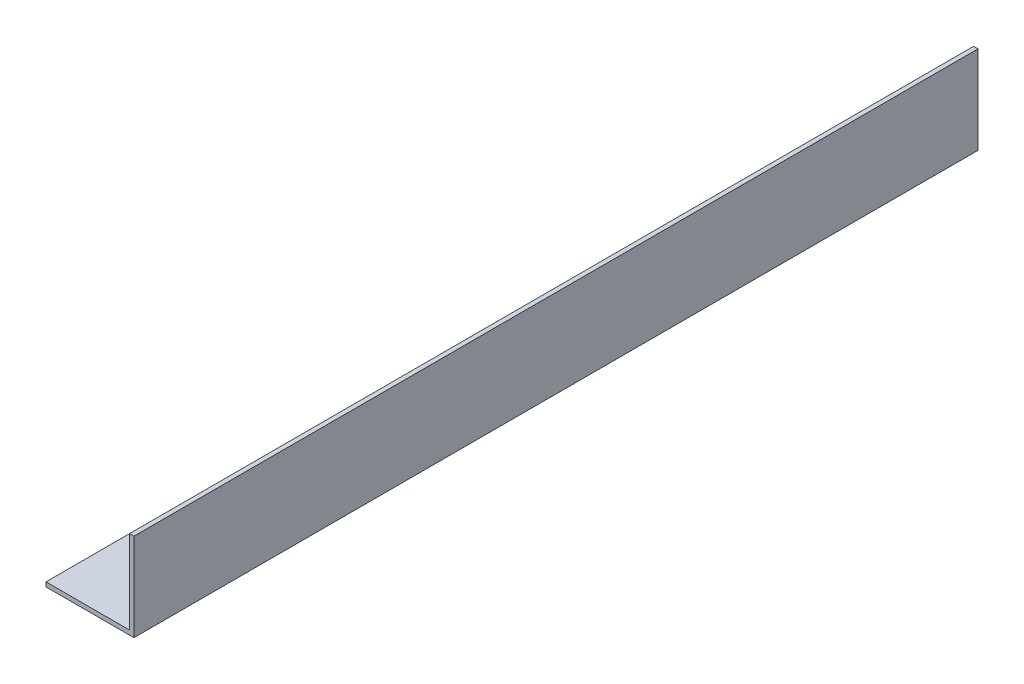
ISO-10303-21;
HEADER;
FILE_DESCRIPTION(('STEP AP214'),'2;1');
FILE_NAME('part.step','',(''),(''),'','','');
FILE_SCHEMA(('AUTOMOTIVE_DESIGN { 1 0 10303 214 1 1 1 1 }'));
ENDSEC;
DATA;
#1=APPLICATION_CONTEXT('core data for automotive mechanical design processes');
#2=APPLICATION_PROTOCOL_DEFINITION('international standard','automotive_design',2000,#1);
#3=PRODUCT_CONTEXT('',#1,'mechanical');
#4=PRODUCT('Part','Part','',(#3));
#5=PRODUCT_RELATED_PRODUCT_CATEGORY('part','',(#4));
#6=PRODUCT_DEFINITION_FORMATION('','',#4);
#7=PRODUCT_DEFINITION_CONTEXT('part definition',#1,'design');
#8=PRODUCT_DEFINITION('design','',#6,#7);
#9=PRODUCT_DEFINITION_SHAPE('','',#8);
#10=(LENGTH_UNIT() NAMED_UNIT(*) SI_UNIT(.MILLI.,.METRE.));
#11=(NAMED_UNIT(*) PLANE_ANGLE_UNIT() SI_UNIT($,.RADIAN.));
#12=(NAMED_UNIT(*) SI_UNIT($,.STERADIAN.) SOLID_ANGLE_UNIT());
#13=UNCERTAINTY_MEASURE_WITH_UNIT(LENGTH_MEASURE(1.E-05),#10,'distance_accuracy_value','');
#14=(GEOMETRIC_REPRESENTATION_CONTEXT(3) GLOBAL_UNCERTAINTY_ASSIGNED_CONTEXT((#13)) GLOBAL_UNIT_ASSIGNED_CONTEXT((#10,
#11,#12)) REPRESENTATION_CONTEXT('',''));
#15=CARTESIAN_POINT('',(0.,0.,0.));
#16=DIRECTION('',(0.,0.,1.));
#17=DIRECTION('',(1.,0.,0.));
#18=AXIS2_PLACEMENT_3D('',#15,#16,#17);
#19=CARTESIAN_POINT('',(-15.875,0.,152.4));
#20=DIRECTION('',(1.,0.,0.));
#21=DIRECTION('',(0.,0.,-1.));
#22=AXIS2_PLACEMENT_3D('',#19,#20,#21);
#23=PLANE('',#22);
#24=DIRECTION('',(0.,-1.,0.));
#25=VECTOR('',#24,1.);
#26=CARTESIAN_POINT('',(-15.875,0.,-152.4));
#27=LINE('',#26,#25);
#28=CARTESIAN_POINT('',(-15.875,1.5875,-152.4));
#29=VERTEX_POINT('',#28);
#30=CARTESIAN_POINT('',(-15.875,0.,-152.4));
#31=VERTEX_POINT('',#30);
#32=EDGE_CURVE('E122',#29,#31,#27,.T.);
#33=ORIENTED_EDGE('',*,*,#32,.T.);
#34=DIRECTION('',(0.,0.,-1.));
#35=VECTOR('',#34,1.);
#36=CARTESIAN_POINT('',(-15.875,0.,152.4));
#37=LINE('',#36,#35);
#38=CARTESIAN_POINT('',(-15.875,0.,152.4));
#39=VERTEX_POINT('',#38);
#40=EDGE_CURVE('E11',#39,#31,#37,.T.);
#41=ORIENTED_EDGE('',*,*,#40,.F.);
#42=DIRECTION('',(0.,-1.,0.));
#43=VECTOR('',#42,1.);
#44=CARTESIAN_POINT('',(-15.875,0.,152.4));
#45=LINE('',#44,#43);
#46=CARTESIAN_POINT('',(-15.875,1.5875,152.4));
#47=VERTEX_POINT('',#46);
#48=EDGE_CURVE('E134',#47,#39,#45,.T.);
#49=ORIENTED_EDGE('',*,*,#48,.F.);
#50=DIRECTION('',(0.,0.,-1.));
#51=VECTOR('',#50,1.);
#52=CARTESIAN_POINT('',(-15.875,1.5875,152.4));
#53=LINE('',#52,#51);
#54=EDGE_CURVE('E118',#47,#29,#53,.T.);
#55=ORIENTED_EDGE('',*,*,#54,.T.);
#56=EDGE_LOOP('',(#33,#41,#49,#55));
#57=FACE_BOUND('',#56,.T.);
#58=ADVANCED_FACE('F32',(#57),#23,.F.);
#59=CARTESIAN_POINT('',(-15.875,0.,152.4));
#60=DIRECTION('',(0.,1.,0.));
#61=DIRECTION('',(0.,0.,1.));
#62=AXIS2_PLACEMENT_3D('',#59,#60,#61);
#63=PLANE('',#62);
#64=DIRECTION('',(1.,0.,0.));
#65=VECTOR('',#64,1.);
#66=CARTESIAN_POINT('',(-15.875,0.,-152.4));
#67=LINE('',#66,#65);
#68=CARTESIAN_POINT('',(15.875,0.,-152.4));
#69=VERTEX_POINT('',#68);
#70=EDGE_CURVE('E125',#31,#69,#67,.T.);
#71=ORIENTED_EDGE('',*,*,#70,.T.);
#72=DIRECTION('',(0.,0.,-1.));
#73=VECTOR('',#72,1.);
#74=CARTESIAN_POINT('',(15.875,0.,152.4));
#75=LINE('',#74,#73);
#76=CARTESIAN_POINT('',(15.875,0.,152.4));
#77=VERTEX_POINT('',#76);
#78=EDGE_CURVE('E40',#77,#69,#75,.T.);
#79=ORIENTED_EDGE('',*,*,#78,.F.);
#80=DIRECTION('',(1.,0.,0.));
#81=VECTOR('',#80,1.);
#82=CARTESIAN_POINT('',(-15.875,0.,152.4));
#83=LINE('',#82,#81);
#84=EDGE_CURVE('E88',#39,#77,#83,.T.);
#85=ORIENTED_EDGE('',*,*,#84,.F.);
#86=ORIENTED_EDGE('',*,*,#40,.T.);
#87=EDGE_LOOP('',(#71,#79,#85,#86));
#88=FACE_BOUND('',#87,.T.);
#89=ADVANCED_FACE('F159',(#88),#63,.F.);
#90=CARTESIAN_POINT('',(15.875,0.,152.4));
#91=DIRECTION('',(-1.,0.,0.));
#92=DIRECTION('',(0.,0.,1.));
#93=AXIS2_PLACEMENT_3D('',#90,#91,#92);
#94=PLANE('',#93);
#95=DIRECTION('',(0.,1.,0.));
#96=VECTOR('',#95,1.);
#97=CARTESIAN_POINT('',(15.875,0.,-152.4));
#98=LINE('',#97,#96);
#99=CARTESIAN_POINT('',(15.875,31.75,-152.4));
#100=VERTEX_POINT('',#99);
#101=EDGE_CURVE('E127',#69,#100,#98,.T.);
#102=ORIENTED_EDGE('',*,*,#101,.T.);
#103=DIRECTION('',(0.,0.,-1.));
#104=VECTOR('',#103,1.);
#105=CARTESIAN_POINT('',(15.875,31.75,152.4));
#106=LINE('',#105,#104);
#107=CARTESIAN_POINT('',(15.875,31.75,152.4));
#108=VERTEX_POINT('',#107);
#109=EDGE_CURVE('E138',#108,#100,#106,.T.);
#110=ORIENTED_EDGE('',*,*,#109,.F.);
#111=DIRECTION('',(0.,1.,0.));
#112=VECTOR('',#111,1.);
#113=CARTESIAN_POINT('',(15.875,0.,152.4));
#114=LINE('',#113,#112);
#115=EDGE_CURVE('E146',#77,#108,#114,.T.);
#116=ORIENTED_EDGE('',*,*,#115,.F.);
#117=ORIENTED_EDGE('',*,*,#78,.T.);
#118=EDGE_LOOP('',(#102,#110,#116,#117));
#119=FACE_BOUND('',#118,.T.);
#120=ADVANCED_FACE('F144',(#119),#94,.F.);
#121=CARTESIAN_POINT('',(15.875,31.75,152.4));
#122=DIRECTION('',(0.,-1.,0.));
#123=DIRECTION('',(0.,0.,-1.));
#124=AXIS2_PLACEMENT_3D('',#121,#122,#123);
#125=PLANE('',#124);
#126=DIRECTION('',(-1.,0.,0.));
#127=VECTOR('',#126,1.);
#128=CARTESIAN_POINT('',(15.875,31.75,-152.4));
#129=LINE('',#128,#127);
#130=CARTESIAN_POINT('',(14.2875,31.75,-152.4));
#131=VERTEX_POINT('',#130);
#132=EDGE_CURVE('E129',#100,#131,#129,.T.);
#133=ORIENTED_EDGE('',*,*,#132,.T.);
#134=DIRECTION('',(0.,0.,-1.));
#135=VECTOR('',#134,1.);
#136=CARTESIAN_POINT('',(14.2875,31.75,152.4));
#137=LINE('',#136,#135);
#138=CARTESIAN_POINT('',(14.2875,31.75,152.4));
#139=VERTEX_POINT('',#138);
#140=EDGE_CURVE('E113',#139,#131,#137,.T.);
#141=ORIENTED_EDGE('',*,*,#140,.F.);
#142=DIRECTION('',(-1.,0.,0.));
#143=VECTOR('',#142,1.);
#144=CARTESIAN_POINT('',(15.875,31.75,152.4));
#145=LINE('',#144,#143);
#146=EDGE_CURVE('E104',#108,#139,#145,.T.);
#147=ORIENTED_EDGE('',*,*,#146,.F.);
#148=ORIENTED_EDGE('',*,*,#109,.T.);
#149=EDGE_LOOP('',(#133,#141,#147,#148));
#150=FACE_BOUND('',#149,.T.);
#151=ADVANCED_FACE('F152',(#150),#125,.F.);
#152=CARTESIAN_POINT('',(14.2875,31.75,152.4));
#153=DIRECTION('',(1.,0.,0.));
#154=DIRECTION('',(0.,1.,0.));
#155=AXIS2_PLACEMENT_3D('',#152,#153,#154);
#156=PLANE('',#155);
#157=DIRECTION('',(0.,-1.,0.));
#158=VECTOR('',#157,1.);
#159=CARTESIAN_POINT('',(14.2875,31.75,-152.4));
#160=LINE('',#159,#158);
#161=CARTESIAN_POINT('',(14.2875,1.9685,-152.4));
#162=VERTEX_POINT('',#161);
#163=EDGE_CURVE('E112',#131,#162,#160,.T.);
#164=ORIENTED_EDGE('',*,*,#163,.T.);
#165=DIRECTION('',(0.,0.,-1.));
#166=VECTOR('',#165,1.);
#167=CARTESIAN_POINT('',(14.2875,1.9685,152.4));
#168=LINE('',#167,#166);
#169=CARTESIAN_POINT('',(14.2875,1.9685,152.4));
#170=VERTEX_POINT('',#169);
#171=EDGE_CURVE('E109',#170,#162,#168,.T.);
#172=ORIENTED_EDGE('',*,*,#171,.F.);
#173=DIRECTION('',(0.,-1.,0.));
#174=VECTOR('',#173,1.);
#175=CARTESIAN_POINT('',(14.2875,31.75,152.4));
#176=LINE('',#175,#174);
#177=EDGE_CURVE('E98',#139,#170,#176,.T.);
#178=ORIENTED_EDGE('',*,*,#177,.F.);
#179=ORIENTED_EDGE('',*,*,#140,.T.);
#180=EDGE_LOOP('',(#164,#172,#178,#179));
#181=FACE_BOUND('',#180,.T.);
#182=ADVANCED_FACE('F110',(#181),#156,.F.);
#183=CARTESIAN_POINT('',(13.9065,1.9685,152.4));
#184=DIRECTION('',(0.,0.,-1.));
#185=DIRECTION('',(-1.,0.,0.));
#186=AXIS2_PLACEMENT_3D('',#183,#184,#185);
#187=CYLINDRICAL_SURFACE('',#186,0.381000000000001);
#188=CARTESIAN_POINT('',(13.9065,1.9685,-152.4));
#189=DIRECTION('',(0.,0.,-1.));
#190=DIRECTION('',(1.,0.,0.));
#191=AXIS2_PLACEMENT_3D('',#188,#189,#190);
#192=CIRCLE('',#191,0.381000000000001);
#193=CARTESIAN_POINT('',(13.9065,1.5875,-152.4));
#194=VERTEX_POINT('',#193);
#195=EDGE_CURVE('E74',#162,#194,#192,.T.);
#196=ORIENTED_EDGE('',*,*,#195,.T.);
#197=DIRECTION('',(0.,0.,-1.));
#198=VECTOR('',#197,1.);
#199=CARTESIAN_POINT('',(13.9065,1.5875,152.4));
#200=LINE('',#199,#198);
#201=CARTESIAN_POINT('',(13.9065,1.5875,152.4));
#202=VERTEX_POINT('',#201);
#203=EDGE_CURVE('E114',#202,#194,#200,.T.);
#204=ORIENTED_EDGE('',*,*,#203,.F.);
#205=CARTESIAN_POINT('',(13.9065,1.9685,152.4));
#206=DIRECTION('',(0.,0.,-1.));
#207=DIRECTION('',(1.,0.,0.));
#208=AXIS2_PLACEMENT_3D('',#205,#206,#207);
#209=CIRCLE('',#208,0.381000000000001);
#210=EDGE_CURVE('E102',#170,#202,#209,.T.);
#211=ORIENTED_EDGE('',*,*,#210,.F.);
#212=ORIENTED_EDGE('',*,*,#171,.T.);
#213=EDGE_LOOP('',(#196,#204,#211,#212));
#214=FACE_BOUND('',#213,.T.);
#215=ADVANCED_FACE('F116',(#214),#187,.F.);
#216=CARTESIAN_POINT('',(13.9065,1.5875,152.4));
#217=DIRECTION('',(0.,-1.,0.));
#218=DIRECTION('',(1.,0.,0.));
#219=AXIS2_PLACEMENT_3D('',#216,#217,#218);
#220=PLANE('',#219);
#221=DIRECTION('',(-1.,0.,0.));
#222=VECTOR('',#221,1.);
#223=CARTESIAN_POINT('',(13.9065,1.5875,-152.4));
#224=LINE('',#223,#222);
#225=EDGE_CURVE('E80',#194,#29,#224,.T.);
#226=ORIENTED_EDGE('',*,*,#225,.T.);
#227=ORIENTED_EDGE('',*,*,#54,.F.);
#228=DIRECTION('',(-1.,0.,0.));
#229=VECTOR('',#228,1.);
#230=CARTESIAN_POINT('',(13.9065,1.5875,152.4));
#231=LINE('',#230,#229);
#232=EDGE_CURVE('E48',#202,#47,#231,.T.);
#233=ORIENTED_EDGE('',*,*,#232,.F.);
#234=ORIENTED_EDGE('',*,*,#203,.T.);
#235=EDGE_LOOP('',(#226,#227,#233,#234));
#236=FACE_BOUND('',#235,.T.);
#237=ADVANCED_FACE('F173',(#236),#220,.F.);
#238=CARTESIAN_POINT('',(13.9065,1.9685,152.4));
#239=DIRECTION('',(0.,0.,1.));
#240=DIRECTION('',(1.,0.,0.));
#241=AXIS2_PLACEMENT_3D('',#238,#239,#240);
#242=PLANE('',#241);
#243=ORIENTED_EDGE('',*,*,#48,.T.);
#244=ORIENTED_EDGE('',*,*,#84,.T.);
#245=ORIENTED_EDGE('',*,*,#115,.T.);
#246=ORIENTED_EDGE('',*,*,#146,.T.);
#247=ORIENTED_EDGE('',*,*,#177,.T.);
#248=ORIENTED_EDGE('',*,*,#210,.T.);
#249=ORIENTED_EDGE('',*,*,#232,.T.);
#250=EDGE_LOOP('',(#243,#244,#245,#246,#247,#248,#249));
#251=FACE_BOUND('',#250,.T.);
#252=ADVANCED_FACE('F100',(#251),#242,.T.);
#253=CARTESIAN_POINT('',(13.9065,1.9685,-152.4));
#254=DIRECTION('',(0.,0.,1.));
#255=DIRECTION('',(1.,0.,0.));
#256=AXIS2_PLACEMENT_3D('',#253,#254,#255);
#257=PLANE('',#256);
#258=ORIENTED_EDGE('',*,*,#32,.F.);
#259=ORIENTED_EDGE('',*,*,#225,.F.);
#260=ORIENTED_EDGE('',*,*,#195,.F.);
#261=ORIENTED_EDGE('',*,*,#163,.F.);
#262=ORIENTED_EDGE('',*,*,#132,.F.);
#263=ORIENTED_EDGE('',*,*,#101,.F.);
#264=ORIENTED_EDGE('',*,*,#70,.F.);
#265=EDGE_LOOP('',(#258,#259,#260,#261,#262,#263,#264));
#266=FACE_BOUND('',#265,.T.);
#267=ADVANCED_FACE('F150',(#266),#257,.F.);
#268=CLOSED_SHELL('',(#58,#89,#120,#151,#182,#215,#237,#252,#267));
#269=MANIFOLD_SOLID_BREP('B2',#268);
#270=ADVANCED_BREP_SHAPE_REPRESENTATION('',(#18,#269),#14);
#271=SHAPE_DEFINITION_REPRESENTATION(#9,#270);
ENDSEC;
END-ISO-10303-21;
